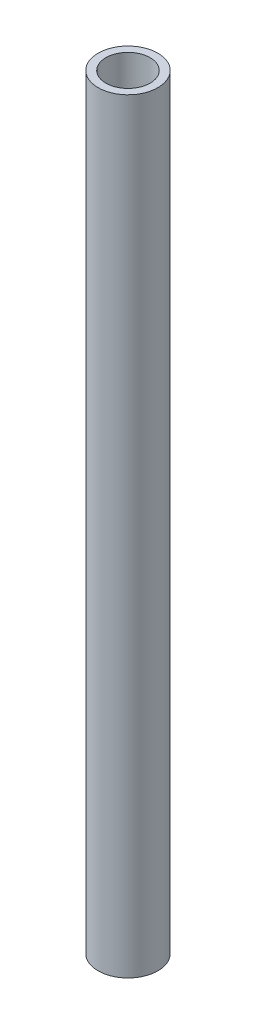
ISO-10303-21;
HEADER;
FILE_DESCRIPTION(('STEP AP214'),'2;1');
FILE_NAME('part.step','',(''),(''),'','','');
FILE_SCHEMA(('AUTOMOTIVE_DESIGN { 1 0 10303 214 1 1 1 1 }'));
ENDSEC;
DATA;
#1=APPLICATION_CONTEXT('core data for automotive mechanical design processes');
#2=APPLICATION_PROTOCOL_DEFINITION('international standard','automotive_design',2000,#1);
#3=PRODUCT_CONTEXT('',#1,'mechanical');
#4=PRODUCT('Part','Part','',(#3));
#5=PRODUCT_RELATED_PRODUCT_CATEGORY('part','',(#4));
#6=PRODUCT_DEFINITION_FORMATION('','',#4);
#7=PRODUCT_DEFINITION_CONTEXT('part definition',#1,'design');
#8=PRODUCT_DEFINITION('design','',#6,#7);
#9=PRODUCT_DEFINITION_SHAPE('','',#8);
#10=(LENGTH_UNIT() NAMED_UNIT(*) SI_UNIT(.MILLI.,.METRE.));
#11=(NAMED_UNIT(*) PLANE_ANGLE_UNIT() SI_UNIT($,.RADIAN.));
#12=(NAMED_UNIT(*) SI_UNIT($,.STERADIAN.) SOLID_ANGLE_UNIT());
#13=UNCERTAINTY_MEASURE_WITH_UNIT(LENGTH_MEASURE(1.E-05),#10,'distance_accuracy_value','');
#14=(GEOMETRIC_REPRESENTATION_CONTEXT(3) GLOBAL_UNCERTAINTY_ASSIGNED_CONTEXT((#13)) GLOBAL_UNIT_ASSIGNED_CONTEXT((#10,
#11,#12)) REPRESENTATION_CONTEXT('',''));
#15=CARTESIAN_POINT('',(0.,0.,0.));
#16=DIRECTION('',(0.,0.,1.));
#17=DIRECTION('',(1.,0.,0.));
#18=AXIS2_PLACEMENT_3D('',#15,#16,#17);
#19=CARTESIAN_POINT('',(0.,273.05,0.));
#20=DIRECTION('',(0.,1.,0.));
#21=DIRECTION('',(0.,0.,1.));
#22=AXIS2_PLACEMENT_3D('',#19,#20,#21);
#23=PLANE('',#22);
#24=CARTESIAN_POINT('',(0.,273.05,0.));
#25=DIRECTION('',(0.,1.,0.));
#26=DIRECTION('',(0.,0.,1.));
#27=AXIS2_PLACEMENT_3D('',#24,#25,#26);
#28=CIRCLE('',#27,10.668);
#29=CARTESIAN_POINT('',(0.,273.05,10.668));
#30=VERTEX_POINT('',#29);
#31=EDGE_CURVE('E10',#30,#30,#28,.T.);
#32=ORIENTED_EDGE('',*,*,#31,.T.);
#33=EDGE_LOOP('',(#32));
#34=FACE_BOUND('',#33,.T.);
#35=CARTESIAN_POINT('',(0.,273.05,0.));
#36=DIRECTION('',(0.,1.,0.));
#37=DIRECTION('',(0.,0.,1.));
#38=AXIS2_PLACEMENT_3D('',#35,#36,#37);
#39=CIRCLE('',#38,7.8994);
#40=CARTESIAN_POINT('',(0.,273.05,7.8994));
#41=VERTEX_POINT('',#40);
#42=EDGE_CURVE('E50',#41,#41,#39,.T.);
#43=ORIENTED_EDGE('',*,*,#42,.F.);
#44=EDGE_LOOP('',(#43));
#45=FACE_BOUND('',#44,.T.);
#46=ADVANCED_FACE('F37',(#34,#45),#23,.T.);
#47=CARTESIAN_POINT('',(0.,0.,0.));
#48=DIRECTION('',(0.,1.,0.));
#49=DIRECTION('',(0.,0.,1.));
#50=AXIS2_PLACEMENT_3D('',#47,#48,#49);
#51=PLANE('',#50);
#52=CARTESIAN_POINT('',(0.,0.,0.));
#53=DIRECTION('',(0.,1.,0.));
#54=DIRECTION('',(0.,0.,1.));
#55=AXIS2_PLACEMENT_3D('',#52,#53,#54);
#56=CIRCLE('',#55,10.668);
#57=CARTESIAN_POINT('',(0.,0.,10.668));
#58=VERTEX_POINT('',#57);
#59=EDGE_CURVE('E41',#58,#58,#56,.T.);
#60=ORIENTED_EDGE('',*,*,#59,.F.);
#61=EDGE_LOOP('',(#60));
#62=FACE_BOUND('',#61,.T.);
#63=CARTESIAN_POINT('',(0.,0.,0.));
#64=DIRECTION('',(0.,1.,0.));
#65=DIRECTION('',(0.,0.,1.));
#66=AXIS2_PLACEMENT_3D('',#63,#64,#65);
#67=CIRCLE('',#66,7.8994);
#68=CARTESIAN_POINT('',(0.,0.,7.8994));
#69=VERTEX_POINT('',#68);
#70=EDGE_CURVE('E52',#69,#69,#67,.T.);
#71=ORIENTED_EDGE('',*,*,#70,.T.);
#72=EDGE_LOOP('',(#71));
#73=FACE_BOUND('',#72,.T.);
#74=ADVANCED_FACE('F64',(#62,#73),#51,.F.);
#75=CARTESIAN_POINT('',(0.,273.05,0.));
#76=DIRECTION('',(0.,-1.,0.));
#77=DIRECTION('',(0.,0.,-1.));
#78=AXIS2_PLACEMENT_3D('',#75,#76,#77);
#79=CYLINDRICAL_SURFACE('',#78,10.668);
#80=ORIENTED_EDGE('',*,*,#31,.F.);
#81=EDGE_LOOP('',(#80));
#82=FACE_BOUND('',#81,.T.);
#83=ORIENTED_EDGE('',*,*,#59,.T.);
#84=EDGE_LOOP('',(#83));
#85=FACE_BOUND('',#84,.T.);
#86=ADVANCED_FACE('F39',(#82,#85),#79,.T.);
#87=CARTESIAN_POINT('',(0.,273.05,0.));
#88=DIRECTION('',(0.,-1.,0.));
#89=DIRECTION('',(0.,0.,-1.));
#90=AXIS2_PLACEMENT_3D('',#87,#88,#89);
#91=CYLINDRICAL_SURFACE('',#90,7.8994);
#92=ORIENTED_EDGE('',*,*,#42,.T.);
#93=EDGE_LOOP('',(#92));
#94=FACE_BOUND('',#93,.T.);
#95=ORIENTED_EDGE('',*,*,#70,.F.);
#96=EDGE_LOOP('',(#95));
#97=FACE_BOUND('',#96,.T.);
#98=ADVANCED_FACE('F60',(#94,#97),#91,.F.);
#99=CLOSED_SHELL('',(#46,#74,#86,#98));
#100=MANIFOLD_SOLID_BREP('B2',#99);
#101=ADVANCED_BREP_SHAPE_REPRESENTATION('',(#18,#100),#14);
#102=SHAPE_DEFINITION_REPRESENTATION(#9,#101);
ENDSEC;
END-ISO-10303-21;
